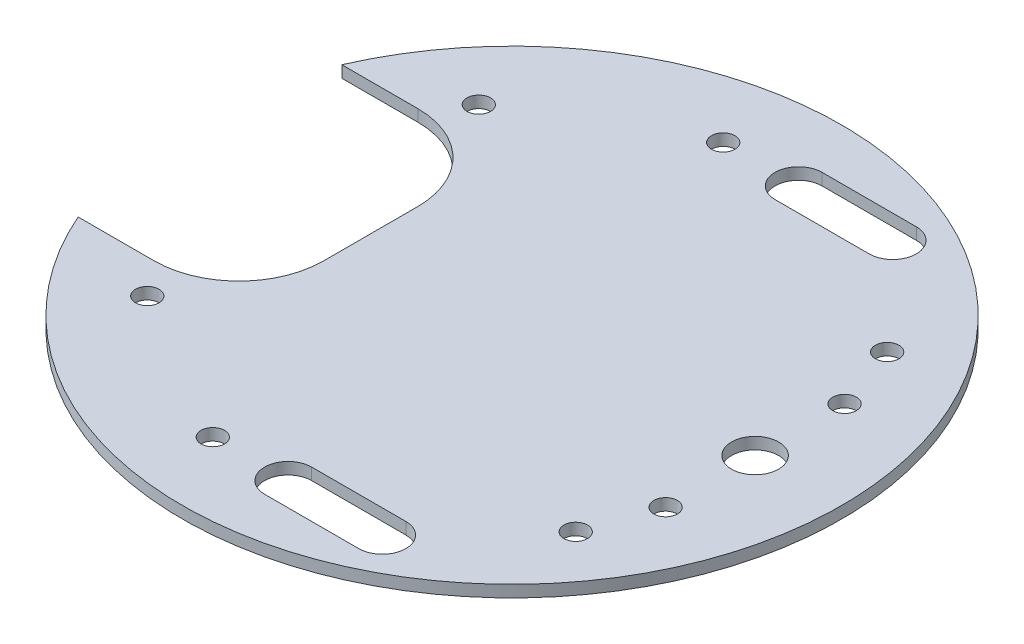
ISO-10303-21;
HEADER;
FILE_DESCRIPTION(('STEP AP214'),'2;1');
FILE_NAME('part.step','',(''),(''),'','','');
FILE_SCHEMA(('AUTOMOTIVE_DESIGN { 1 0 10303 214 1 1 1 1 }'));
ENDSEC;
DATA;
#1=APPLICATION_CONTEXT('core data for automotive mechanical design processes');
#2=APPLICATION_PROTOCOL_DEFINITION('international standard','automotive_design',2000,#1);
#3=PRODUCT_CONTEXT('',#1,'mechanical');
#4=PRODUCT('Part','Part','',(#3));
#5=PRODUCT_RELATED_PRODUCT_CATEGORY('part','',(#4));
#6=PRODUCT_DEFINITION_FORMATION('','',#4);
#7=PRODUCT_DEFINITION_CONTEXT('part definition',#1,'design');
#8=PRODUCT_DEFINITION('design','',#6,#7);
#9=PRODUCT_DEFINITION_SHAPE('','',#8);
#10=(LENGTH_UNIT() NAMED_UNIT(*) SI_UNIT(.MILLI.,.METRE.));
#11=(NAMED_UNIT(*) PLANE_ANGLE_UNIT() SI_UNIT($,.RADIAN.));
#12=(NAMED_UNIT(*) SI_UNIT($,.STERADIAN.) SOLID_ANGLE_UNIT());
#13=UNCERTAINTY_MEASURE_WITH_UNIT(LENGTH_MEASURE(1.E-05),#10,'distance_accuracy_value','');
#14=(GEOMETRIC_REPRESENTATION_CONTEXT(3) GLOBAL_UNCERTAINTY_ASSIGNED_CONTEXT((#13)) GLOBAL_UNIT_ASSIGNED_CONTEXT((#10,
#11,#12)) REPRESENTATION_CONTEXT('',''));
#15=CARTESIAN_POINT('',(0.,0.,0.));
#16=DIRECTION('',(0.,0.,1.));
#17=DIRECTION('',(1.,0.,0.));
#18=AXIS2_PLACEMENT_3D('',#15,#16,#17);
#19=CARTESIAN_POINT('',(0.,3.175,0.));
#20=DIRECTION('',(0.,-1.,0.));
#21=DIRECTION('',(0.,0.,-1.));
#22=AXIS2_PLACEMENT_3D('',#19,#20,#21);
#23=CYLINDRICAL_SURFACE('',#22,88.9);
#24=CARTESIAN_POINT('',(0.,3.175,0.));
#25=DIRECTION('',(0.,1.,0.));
#26=DIRECTION('',(0.,0.,1.));
#27=AXIS2_PLACEMENT_3D('',#24,#25,#26);
#28=CIRCLE('',#27,88.9);
#29=CARTESIAN_POINT('',(-81.4781958563148,3.175,35.56));
#30=VERTEX_POINT('',#29);
#31=CARTESIAN_POINT('',(-81.4781958563148,3.175,-35.56));
#32=VERTEX_POINT('',#31);
#33=EDGE_CURVE('E270',#30,#32,#28,.T.);
#34=ORIENTED_EDGE('',*,*,#33,.F.);
#35=DIRECTION('',(0.,-1.,0.));
#36=VECTOR('',#35,1.);
#37=CARTESIAN_POINT('',(-81.4781958563148,3.175,35.56));
#38=LINE('',#37,#36);
#39=CARTESIAN_POINT('',(-81.4781958563148,0.,35.56));
#40=VERTEX_POINT('',#39);
#41=EDGE_CURVE('E266',#30,#40,#38,.T.);
#42=ORIENTED_EDGE('',*,*,#41,.T.);
#43=CARTESIAN_POINT('',(0.,0.,0.));
#44=DIRECTION('',(0.,1.,0.));
#45=DIRECTION('',(0.,0.,1.));
#46=AXIS2_PLACEMENT_3D('',#43,#44,#45);
#47=CIRCLE('',#46,88.9);
#48=CARTESIAN_POINT('',(-81.4781958563148,0.,-35.56));
#49=VERTEX_POINT('',#48);
#50=EDGE_CURVE('E269',#40,#49,#47,.T.);
#51=ORIENTED_EDGE('',*,*,#50,.T.);
#52=DIRECTION('',(0.,-1.,0.));
#53=VECTOR('',#52,1.);
#54=CARTESIAN_POINT('',(-81.4781958563148,3.175,-35.56));
#55=LINE('',#54,#53);
#56=EDGE_CURVE('E261',#49,#32,#55,.F.);
#57=ORIENTED_EDGE('',*,*,#56,.T.);
#58=EDGE_LOOP('',(#34,#42,#51,#57));
#59=FACE_BOUND('',#58,.T.);
#60=ADVANCED_FACE('F33',(#59),#23,.T.);
#61=CARTESIAN_POINT('',(0.,3.175,0.));
#62=DIRECTION('',(0.,1.,0.));
#63=DIRECTION('',(0.,0.,1.));
#64=AXIS2_PLACEMENT_3D('',#61,#62,#63);
#65=PLANE('',#64);
#66=CARTESIAN_POINT('',(59.175,3.175,42.));
#67=DIRECTION('',(0.,-1.,0.));
#68=DIRECTION('',(0.,0.,-1.));
#69=AXIS2_PLACEMENT_3D('',#66,#67,#68);
#70=CIRCLE('',#69,3.175);
#71=CARTESIAN_POINT('',(59.175,3.175,38.825));
#72=VERTEX_POINT('',#71);
#73=EDGE_CURVE('E299',#72,#72,#70,.T.);
#74=ORIENTED_EDGE('',*,*,#73,.T.);
#75=EDGE_LOOP('',(#74));
#76=FACE_BOUND('',#75,.T.);
#77=CARTESIAN_POINT('',(59.175,3.175,-42.));
#78=DIRECTION('',(0.,1.,0.));
#79=DIRECTION('',(0.,0.,1.));
#80=AXIS2_PLACEMENT_3D('',#77,#78,#79);
#81=CIRCLE('',#80,3.175);
#82=CARTESIAN_POINT('',(59.175,3.175,-38.825));
#83=VERTEX_POINT('',#82);
#84=EDGE_CURVE('E162',#83,#83,#81,.T.);
#85=ORIENTED_EDGE('',*,*,#84,.F.);
#86=EDGE_LOOP('',(#85));
#87=FACE_BOUND('',#86,.T.);
#88=DIRECTION('',(1.,0.,0.));
#89=VECTOR('',#88,1.);
#90=CARTESIAN_POINT('',(0.,3.175,-62.4827214621127));
#91=LINE('',#90,#89);
#92=CARTESIAN_POINT('',(8.44233372588642,3.175,-62.4827214621127));
#93=VERTEX_POINT('',#92);
#94=CARTESIAN_POINT('',(33.8423337258864,3.175,-62.4827214621127));
#95=VERTEX_POINT('',#94);
#96=EDGE_CURVE('E50',#93,#95,#91,.T.);
#97=ORIENTED_EDGE('',*,*,#96,.F.);
#98=CARTESIAN_POINT('',(8.44233372588642,3.175,-68.8327214621127));
#99=DIRECTION('',(0.,1.,0.));
#100=DIRECTION('',(0.,0.,1.));
#101=AXIS2_PLACEMENT_3D('',#98,#99,#100);
#102=CIRCLE('',#101,6.34999999999999);
#103=CARTESIAN_POINT('',(8.44233372588642,3.175,-75.1827214621127));
#104=VERTEX_POINT('',#103);
#105=EDGE_CURVE('E156',#104,#93,#102,.T.);
#106=ORIENTED_EDGE('',*,*,#105,.F.);
#107=DIRECTION('',(1.,0.,0.));
#108=VECTOR('',#107,1.);
#109=CARTESIAN_POINT('',(0.,3.175,-75.1827214621127));
#110=LINE('',#109,#108);
#111=CARTESIAN_POINT('',(33.8423337258864,3.175,-75.1827214621127));
#112=VERTEX_POINT('',#111);
#113=EDGE_CURVE('E159',#104,#112,#110,.T.);
#114=ORIENTED_EDGE('',*,*,#113,.T.);
#115=CARTESIAN_POINT('',(33.8423337258864,3.175,-68.8327214621127));
#116=DIRECTION('',(0.,1.,0.));
#117=DIRECTION('',(0.,0.,1.));
#118=AXIS2_PLACEMENT_3D('',#115,#116,#117);
#119=CIRCLE('',#118,6.34999999999999);
#120=EDGE_CURVE('E168',#95,#112,#119,.T.);
#121=ORIENTED_EDGE('',*,*,#120,.F.);
#122=EDGE_LOOP('',(#97,#106,#114,#121));
#123=FACE_BOUND('',#122,.T.);
#124=CARTESIAN_POINT('',(65.5497185348647,3.175,0.));
#125=DIRECTION('',(0.,1.,0.));
#126=DIRECTION('',(0.,0.,1.));
#127=AXIS2_PLACEMENT_3D('',#124,#125,#126);
#128=CIRCLE('',#127,6.35);
#129=CARTESIAN_POINT('',(65.5497185348647,3.175,6.35));
#130=VERTEX_POINT('',#129);
#131=EDGE_CURVE('E181',#130,#130,#128,.T.);
#132=ORIENTED_EDGE('',*,*,#131,.F.);
#133=EDGE_LOOP('',(#132));
#134=FACE_BOUND('',#133,.T.);
#135=DIRECTION('',(1.,0.,0.));
#136=VECTOR('',#135,1.);
#137=CARTESIAN_POINT('',(0.,3.175,75.1827214621126));
#138=LINE('',#137,#136);
#139=CARTESIAN_POINT('',(8.44233372588644,3.175,75.1827214621126));
#140=VERTEX_POINT('',#139);
#141=CARTESIAN_POINT('',(33.8423337258864,3.175,75.1827214621126));
#142=VERTEX_POINT('',#141);
#143=EDGE_CURVE('E58',#140,#142,#138,.T.);
#144=ORIENTED_EDGE('',*,*,#143,.F.);
#145=CARTESIAN_POINT('',(8.44233372588644,3.175,68.8327214621126));
#146=DIRECTION('',(0.,1.,0.));
#147=DIRECTION('',(0.,0.,1.));
#148=AXIS2_PLACEMENT_3D('',#145,#146,#147);
#149=CIRCLE('',#148,6.34999999999999);
#150=CARTESIAN_POINT('',(8.44233372588644,3.175,62.4827214621126));
#151=VERTEX_POINT('',#150);
#152=EDGE_CURVE('E189',#151,#140,#149,.T.);
#153=ORIENTED_EDGE('',*,*,#152,.F.);
#154=DIRECTION('',(1.,0.,0.));
#155=VECTOR('',#154,1.);
#156=CARTESIAN_POINT('',(0.,3.175,62.4827214621126));
#157=LINE('',#156,#155);
#158=CARTESIAN_POINT('',(33.8423337258864,3.175,62.4827214621126));
#159=VERTEX_POINT('',#158);
#160=EDGE_CURVE('E204',#151,#159,#157,.T.);
#161=ORIENTED_EDGE('',*,*,#160,.T.);
#162=CARTESIAN_POINT('',(33.8423337258864,3.175,68.8327214621126));
#163=DIRECTION('',(0.,1.,0.));
#164=DIRECTION('',(0.,0.,1.));
#165=AXIS2_PLACEMENT_3D('',#162,#163,#164);
#166=CIRCLE('',#165,6.34999999999999);
#167=EDGE_CURVE('E200',#142,#159,#166,.T.);
#168=ORIENTED_EDGE('',*,*,#167,.F.);
#169=EDGE_LOOP('',(#144,#153,#161,#168));
#170=FACE_BOUND('',#169,.T.);
#171=DIRECTION('',(1.,0.,0.));
#172=VECTOR('',#171,1.);
#173=CARTESIAN_POINT('',(-88.9,3.175,35.56));
#174=LINE('',#173,#172);
#175=CARTESIAN_POINT('',(-60.96,3.175,35.56));
#176=VERTEX_POINT('',#175);
#177=EDGE_CURVE('E247',#30,#176,#174,.T.);
#178=ORIENTED_EDGE('',*,*,#177,.F.);
#179=ORIENTED_EDGE('',*,*,#33,.T.);
#180=DIRECTION('',(-1.,0.,0.));
#181=VECTOR('',#180,1.);
#182=CARTESIAN_POINT('',(-38.1,3.175,-35.56));
#183=LINE('',#182,#181);
#184=CARTESIAN_POINT('',(-60.96,3.175,-35.56));
#185=VERTEX_POINT('',#184);
#186=EDGE_CURVE('E250',#185,#32,#183,.T.);
#187=ORIENTED_EDGE('',*,*,#186,.F.);
#188=CARTESIAN_POINT('',(-60.96,3.175,-12.7));
#189=DIRECTION('',(0.,1.,0.));
#190=DIRECTION('',(0.,0.,1.));
#191=AXIS2_PLACEMENT_3D('',#188,#189,#190);
#192=CIRCLE('',#191,22.86);
#193=CARTESIAN_POINT('',(-38.1,3.175,-12.7));
#194=VERTEX_POINT('',#193);
#195=EDGE_CURVE('E42',#185,#194,#192,.F.);
#196=ORIENTED_EDGE('',*,*,#195,.T.);
#197=DIRECTION('',(0.,0.,-1.));
#198=VECTOR('',#197,1.);
#199=CARTESIAN_POINT('',(-38.1,3.175,35.56));
#200=LINE('',#199,#198);
#201=CARTESIAN_POINT('',(-38.1,3.175,12.7));
#202=VERTEX_POINT('',#201);
#203=EDGE_CURVE('E246',#202,#194,#200,.T.);
#204=ORIENTED_EDGE('',*,*,#203,.F.);
#205=CARTESIAN_POINT('',(-60.96,3.175,12.7));
#206=DIRECTION('',(0.,1.,0.));
#207=DIRECTION('',(0.,0.,1.));
#208=AXIS2_PLACEMENT_3D('',#205,#206,#207);
#209=CIRCLE('',#208,22.86);
#210=EDGE_CURVE('E288',#202,#176,#209,.F.);
#211=ORIENTED_EDGE('',*,*,#210,.T.);
#212=EDGE_LOOP('',(#178,#179,#187,#196,#204,#211));
#213=FACE_BOUND('',#212,.T.);
#214=CARTESIAN_POINT('',(-53.672052260751,3.175,44.7027214621126));
#215=DIRECTION('',(0.,1.,0.));
#216=DIRECTION('',(0.,0.,1.));
#217=AXIS2_PLACEMENT_3D('',#214,#215,#216);
#218=CIRCLE('',#217,3.175);
#219=CARTESIAN_POINT('',(-53.672052260751,3.175,47.8777214621126));
#220=VERTEX_POINT('',#219);
#221=EDGE_CURVE('E240',#220,#220,#218,.T.);
#222=ORIENTED_EDGE('',*,*,#221,.F.);
#223=EDGE_LOOP('',(#222));
#224=FACE_BOUND('',#223,.T.);
#225=CARTESIAN_POINT('',(-11.8776662741139,3.175,68.8327214621126));
#226=DIRECTION('',(0.,1.,0.));
#227=DIRECTION('',(0.,0.,1.));
#228=AXIS2_PLACEMENT_3D('',#225,#226,#227);
#229=CIRCLE('',#228,3.17499999999999);
#230=CARTESIAN_POINT('',(-11.8776662741139,3.175,72.0077214621126));
#231=VERTEX_POINT('',#230);
#232=EDGE_CURVE('E234',#231,#231,#229,.T.);
#233=ORIENTED_EDGE('',*,*,#232,.F.);
#234=EDGE_LOOP('',(#233));
#235=FACE_BOUND('',#234,.T.);
#236=CARTESIAN_POINT('',(65.5497185348648,3.175,24.13));
#237=DIRECTION('',(0.,1.,0.));
#238=DIRECTION('',(0.,0.,1.));
#239=AXIS2_PLACEMENT_3D('',#236,#237,#238);
#240=CIRCLE('',#239,3.175);
#241=CARTESIAN_POINT('',(65.5497185348648,3.175,27.305));
#242=VERTEX_POINT('',#241);
#243=EDGE_CURVE('E228',#242,#242,#240,.T.);
#244=ORIENTED_EDGE('',*,*,#243,.F.);
#245=EDGE_LOOP('',(#244));
#246=FACE_BOUND('',#245,.T.);
#247=CARTESIAN_POINT('',(65.5497185348648,3.175,-24.13));
#248=DIRECTION('',(0.,1.,0.));
#249=DIRECTION('',(0.,0.,1.));
#250=AXIS2_PLACEMENT_3D('',#247,#248,#249);
#251=CIRCLE('',#250,3.175);
#252=CARTESIAN_POINT('',(65.5497185348648,3.175,-20.955));
#253=VERTEX_POINT('',#252);
#254=EDGE_CURVE('E222',#253,#253,#251,.T.);
#255=ORIENTED_EDGE('',*,*,#254,.F.);
#256=EDGE_LOOP('',(#255));
#257=FACE_BOUND('',#256,.T.);
#258=CARTESIAN_POINT('',(-11.877666274114,3.175,-68.8327214621127));
#259=DIRECTION('',(0.,1.,0.));
#260=DIRECTION('',(0.,0.,1.));
#261=AXIS2_PLACEMENT_3D('',#258,#259,#260);
#262=CIRCLE('',#261,3.175);
#263=CARTESIAN_POINT('',(-11.877666274114,3.175,-65.6577214621127));
#264=VERTEX_POINT('',#263);
#265=EDGE_CURVE('E215',#264,#264,#262,.T.);
#266=ORIENTED_EDGE('',*,*,#265,.F.);
#267=EDGE_LOOP('',(#266));
#268=FACE_BOUND('',#267,.T.);
#269=CARTESIAN_POINT('',(-53.672052260751,3.175,-44.7027214621127));
#270=DIRECTION('',(0.,1.,0.));
#271=DIRECTION('',(0.,0.,1.));
#272=AXIS2_PLACEMENT_3D('',#269,#270,#271);
#273=CIRCLE('',#272,3.17499999999999);
#274=CARTESIAN_POINT('',(-53.672052260751,3.175,-41.5277214621127));
#275=VERTEX_POINT('',#274);
#276=EDGE_CURVE('E218',#275,#275,#273,.T.);
#277=ORIENTED_EDGE('',*,*,#276,.F.);
#278=EDGE_LOOP('',(#277));
#279=FACE_BOUND('',#278,.T.);
#280=ADVANCED_FACE('F305',(#76,#87,#123,#134,#170,#213,#224,#235,#246,#257,#268,#279),#65,.T.);
#281=CARTESIAN_POINT('',(0.,0.,0.));
#282=DIRECTION('',(0.,1.,0.));
#283=DIRECTION('',(0.,0.,1.));
#284=AXIS2_PLACEMENT_3D('',#281,#282,#283);
#285=PLANE('',#284);
#286=CARTESIAN_POINT('',(59.175,0.,42.));
#287=DIRECTION('',(0.,1.,0.));
#288=DIRECTION('',(0.,0.,1.));
#289=AXIS2_PLACEMENT_3D('',#286,#287,#288);
#290=CIRCLE('',#289,3.175);
#291=CARTESIAN_POINT('',(59.175,0.,45.175));
#292=VERTEX_POINT('',#291);
#293=EDGE_CURVE('E37',#292,#292,#290,.F.);
#294=ORIENTED_EDGE('',*,*,#293,.F.);
#295=EDGE_LOOP('',(#294));
#296=FACE_BOUND('',#295,.T.);
#297=CARTESIAN_POINT('',(59.175,0.,-42.));
#298=DIRECTION('',(0.,1.,0.));
#299=DIRECTION('',(0.,0.,1.));
#300=AXIS2_PLACEMENT_3D('',#297,#298,#299);
#301=CIRCLE('',#300,3.175);
#302=CARTESIAN_POINT('',(59.175,0.,-38.825));
#303=VERTEX_POINT('',#302);
#304=EDGE_CURVE('E201',#303,#303,#301,.T.);
#305=ORIENTED_EDGE('',*,*,#304,.T.);
#306=EDGE_LOOP('',(#305));
#307=FACE_BOUND('',#306,.T.);
#308=CARTESIAN_POINT('',(8.44233372588642,0.,-68.8327214621127));
#309=DIRECTION('',(0.,1.,0.));
#310=DIRECTION('',(0.,0.,1.));
#311=AXIS2_PLACEMENT_3D('',#308,#309,#310);
#312=CIRCLE('',#311,6.34999999999999);
#313=CARTESIAN_POINT('',(8.44233372588642,0.,-75.1827214621127));
#314=VERTEX_POINT('',#313);
#315=CARTESIAN_POINT('',(8.44233372588642,0.,-62.4827214621127));
#316=VERTEX_POINT('',#315);
#317=EDGE_CURVE('E143',#314,#316,#312,.T.);
#318=ORIENTED_EDGE('',*,*,#317,.T.);
#319=DIRECTION('',(1.,0.,0.));
#320=VECTOR('',#319,1.);
#321=CARTESIAN_POINT('',(0.,0.,-62.4827214621127));
#322=LINE('',#321,#320);
#323=CARTESIAN_POINT('',(33.8423337258864,0.,-62.4827214621127));
#324=VERTEX_POINT('',#323);
#325=EDGE_CURVE('E137',#316,#324,#322,.T.);
#326=ORIENTED_EDGE('',*,*,#325,.T.);
#327=CARTESIAN_POINT('',(33.8423337258864,0.,-68.8327214621127));
#328=DIRECTION('',(0.,1.,0.));
#329=DIRECTION('',(0.,0.,1.));
#330=AXIS2_PLACEMENT_3D('',#327,#328,#329);
#331=CIRCLE('',#330,6.34999999999999);
#332=CARTESIAN_POINT('',(33.8423337258864,0.,-75.1827214621127));
#333=VERTEX_POINT('',#332);
#334=EDGE_CURVE('E146',#324,#333,#331,.T.);
#335=ORIENTED_EDGE('',*,*,#334,.T.);
#336=DIRECTION('',(1.,0.,0.));
#337=VECTOR('',#336,1.);
#338=CARTESIAN_POINT('',(0.,0.,-75.1827214621127));
#339=LINE('',#338,#337);
#340=EDGE_CURVE('E151',#314,#333,#339,.T.);
#341=ORIENTED_EDGE('',*,*,#340,.F.);
#342=EDGE_LOOP('',(#318,#326,#335,#341));
#343=FACE_BOUND('',#342,.T.);
#344=CARTESIAN_POINT('',(65.5497185348647,0.,0.));
#345=DIRECTION('',(0.,1.,0.));
#346=DIRECTION('',(0.,0.,1.));
#347=AXIS2_PLACEMENT_3D('',#344,#345,#346);
#348=CIRCLE('',#347,6.35);
#349=CARTESIAN_POINT('',(65.5497185348647,0.,6.35));
#350=VERTEX_POINT('',#349);
#351=EDGE_CURVE('E169',#350,#350,#348,.T.);
#352=ORIENTED_EDGE('',*,*,#351,.T.);
#353=EDGE_LOOP('',(#352));
#354=FACE_BOUND('',#353,.T.);
#355=CARTESIAN_POINT('',(8.44233372588644,0.,68.8327214621126));
#356=DIRECTION('',(0.,1.,0.));
#357=DIRECTION('',(0.,0.,1.));
#358=AXIS2_PLACEMENT_3D('',#355,#356,#357);
#359=CIRCLE('',#358,6.34999999999999);
#360=CARTESIAN_POINT('',(8.44233372588644,0.,62.4827214621126));
#361=VERTEX_POINT('',#360);
#362=CARTESIAN_POINT('',(8.44233372588644,0.,75.1827214621126));
#363=VERTEX_POINT('',#362);
#364=EDGE_CURVE('E195',#361,#363,#359,.T.);
#365=ORIENTED_EDGE('',*,*,#364,.T.);
#366=DIRECTION('',(1.,0.,0.));
#367=VECTOR('',#366,1.);
#368=CARTESIAN_POINT('',(0.,0.,75.1827214621126));
#369=LINE('',#368,#367);
#370=CARTESIAN_POINT('',(33.8423337258864,0.,75.1827214621126));
#371=VERTEX_POINT('',#370);
#372=EDGE_CURVE('E185',#363,#371,#369,.T.);
#373=ORIENTED_EDGE('',*,*,#372,.T.);
#374=CARTESIAN_POINT('',(33.8423337258864,0.,68.8327214621126));
#375=DIRECTION('',(0.,1.,0.));
#376=DIRECTION('',(0.,0.,1.));
#377=AXIS2_PLACEMENT_3D('',#374,#375,#376);
#378=CIRCLE('',#377,6.34999999999999);
#379=CARTESIAN_POINT('',(33.8423337258864,0.,62.4827214621126));
#380=VERTEX_POINT('',#379);
#381=EDGE_CURVE('E188',#371,#380,#378,.T.);
#382=ORIENTED_EDGE('',*,*,#381,.T.);
#383=DIRECTION('',(1.,0.,0.));
#384=VECTOR('',#383,1.);
#385=CARTESIAN_POINT('',(0.,0.,62.4827214621126));
#386=LINE('',#385,#384);
#387=EDGE_CURVE('E192',#361,#380,#386,.T.);
#388=ORIENTED_EDGE('',*,*,#387,.F.);
#389=EDGE_LOOP('',(#365,#373,#382,#388));
#390=FACE_BOUND('',#389,.T.);
#391=CARTESIAN_POINT('',(-53.672052260751,0.,44.7027214621126));
#392=DIRECTION('',(0.,1.,0.));
#393=DIRECTION('',(0.,0.,1.));
#394=AXIS2_PLACEMENT_3D('',#391,#392,#393);
#395=CIRCLE('',#394,3.175);
#396=CARTESIAN_POINT('',(-53.672052260751,0.,47.8777214621126));
#397=VERTEX_POINT('',#396);
#398=EDGE_CURVE('E243',#397,#397,#395,.T.);
#399=ORIENTED_EDGE('',*,*,#398,.T.);
#400=EDGE_LOOP('',(#399));
#401=FACE_BOUND('',#400,.T.);
#402=CARTESIAN_POINT('',(-11.8776662741139,0.,68.8327214621126));
#403=DIRECTION('',(0.,1.,0.));
#404=DIRECTION('',(0.,0.,1.));
#405=AXIS2_PLACEMENT_3D('',#402,#403,#404);
#406=CIRCLE('',#405,3.17499999999999);
#407=CARTESIAN_POINT('',(-11.8776662741139,0.,72.0077214621126));
#408=VERTEX_POINT('',#407);
#409=EDGE_CURVE('E237',#408,#408,#406,.T.);
#410=ORIENTED_EDGE('',*,*,#409,.T.);
#411=EDGE_LOOP('',(#410));
#412=FACE_BOUND('',#411,.T.);
#413=CARTESIAN_POINT('',(65.5497185348648,0.,24.13));
#414=DIRECTION('',(0.,1.,0.));
#415=DIRECTION('',(0.,0.,1.));
#416=AXIS2_PLACEMENT_3D('',#413,#414,#415);
#417=CIRCLE('',#416,3.175);
#418=CARTESIAN_POINT('',(65.5497185348648,0.,27.305));
#419=VERTEX_POINT('',#418);
#420=EDGE_CURVE('E231',#419,#419,#417,.T.);
#421=ORIENTED_EDGE('',*,*,#420,.T.);
#422=EDGE_LOOP('',(#421));
#423=FACE_BOUND('',#422,.T.);
#424=CARTESIAN_POINT('',(65.5497185348648,0.,-24.13));
#425=DIRECTION('',(0.,1.,0.));
#426=DIRECTION('',(0.,0.,1.));
#427=AXIS2_PLACEMENT_3D('',#424,#425,#426);
#428=CIRCLE('',#427,3.175);
#429=CARTESIAN_POINT('',(65.5497185348648,0.,-20.955));
#430=VERTEX_POINT('',#429);
#431=EDGE_CURVE('E225',#430,#430,#428,.T.);
#432=ORIENTED_EDGE('',*,*,#431,.T.);
#433=EDGE_LOOP('',(#432));
#434=FACE_BOUND('',#433,.T.);
#435=CARTESIAN_POINT('',(-11.877666274114,0.,-68.8327214621127));
#436=DIRECTION('',(0.,1.,0.));
#437=DIRECTION('',(0.,0.,1.));
#438=AXIS2_PLACEMENT_3D('',#435,#436,#437);
#439=CIRCLE('',#438,3.175);
#440=CARTESIAN_POINT('',(-11.877666274114,0.,-65.6577214621127));
#441=VERTEX_POINT('',#440);
#442=EDGE_CURVE('E219',#441,#441,#439,.T.);
#443=ORIENTED_EDGE('',*,*,#442,.T.);
#444=EDGE_LOOP('',(#443));
#445=FACE_BOUND('',#444,.T.);
#446=CARTESIAN_POINT('',(-53.672052260751,0.,-44.7027214621127));
#447=DIRECTION('',(0.,1.,0.));
#448=DIRECTION('',(0.,0.,1.));
#449=AXIS2_PLACEMENT_3D('',#446,#447,#448);
#450=CIRCLE('',#449,3.17499999999999);
#451=CARTESIAN_POINT('',(-53.672052260751,0.,-41.5277214621127));
#452=VERTEX_POINT('',#451);
#453=EDGE_CURVE('E258',#452,#452,#450,.T.);
#454=ORIENTED_EDGE('',*,*,#453,.T.);
#455=EDGE_LOOP('',(#454));
#456=FACE_BOUND('',#455,.T.);
#457=ORIENTED_EDGE('',*,*,#50,.F.);
#458=DIRECTION('',(1.,0.,0.));
#459=VECTOR('',#458,1.);
#460=CARTESIAN_POINT('',(0.,0.,35.56));
#461=LINE('',#460,#459);
#462=CARTESIAN_POINT('',(-60.96,0.,35.56));
#463=VERTEX_POINT('',#462);
#464=EDGE_CURVE('E273',#40,#463,#461,.T.);
#465=ORIENTED_EDGE('',*,*,#464,.T.);
#466=CARTESIAN_POINT('',(-60.96,0.,12.7));
#467=DIRECTION('',(0.,1.,0.));
#468=DIRECTION('',(0.,0.,1.));
#469=AXIS2_PLACEMENT_3D('',#466,#467,#468);
#470=CIRCLE('',#469,22.86);
#471=CARTESIAN_POINT('',(-38.1,0.,12.7));
#472=VERTEX_POINT('',#471);
#473=EDGE_CURVE('E290',#463,#472,#470,.T.);
#474=ORIENTED_EDGE('',*,*,#473,.T.);
#475=DIRECTION('',(0.,0.,-1.));
#476=VECTOR('',#475,1.);
#477=CARTESIAN_POINT('',(-38.1,0.,35.56));
#478=LINE('',#477,#476);
#479=CARTESIAN_POINT('',(-38.1,0.,-12.7));
#480=VERTEX_POINT('',#479);
#481=EDGE_CURVE('E251',#472,#480,#478,.T.);
#482=ORIENTED_EDGE('',*,*,#481,.T.);
#483=CARTESIAN_POINT('',(-60.96,0.,-12.7));
#484=DIRECTION('',(0.,1.,0.));
#485=DIRECTION('',(0.,0.,1.));
#486=AXIS2_PLACEMENT_3D('',#483,#484,#485);
#487=CIRCLE('',#486,22.86);
#488=CARTESIAN_POINT('',(-60.96,0.,-35.56));
#489=VERTEX_POINT('',#488);
#490=EDGE_CURVE('E12',#480,#489,#487,.T.);
#491=ORIENTED_EDGE('',*,*,#490,.T.);
#492=DIRECTION('',(-1.,0.,0.));
#493=VECTOR('',#492,1.);
#494=CARTESIAN_POINT('',(-38.1,0.,-35.56));
#495=LINE('',#494,#493);
#496=EDGE_CURVE('E175',#489,#49,#495,.T.);
#497=ORIENTED_EDGE('',*,*,#496,.T.);
#498=EDGE_LOOP('',(#457,#465,#474,#482,#491,#497));
#499=FACE_BOUND('',#498,.T.);
#500=ADVANCED_FACE('F153',(#296,#307,#343,#354,#390,#401,#412,#423,#434,#445,#456,#499),#285,.F.);
#501=CARTESIAN_POINT('',(-53.672052260751,0.,-44.7027214621127));
#502=DIRECTION('',(0.,1.,0.));
#503=DIRECTION('',(0.,0.,1.));
#504=AXIS2_PLACEMENT_3D('',#501,#502,#503);
#505=CYLINDRICAL_SURFACE('',#504,3.17499999999999);
#506=ORIENTED_EDGE('',*,*,#453,.F.);
#507=EDGE_LOOP('',(#506));
#508=FACE_BOUND('',#507,.T.);
#509=ORIENTED_EDGE('',*,*,#276,.T.);
#510=EDGE_LOOP('',(#509));
#511=FACE_BOUND('',#510,.T.);
#512=ADVANCED_FACE('F369',(#508,#511),#505,.F.);
#513=CARTESIAN_POINT('',(-11.877666274114,0.,-68.8327214621127));
#514=DIRECTION('',(0.,1.,0.));
#515=DIRECTION('',(0.,0.,1.));
#516=AXIS2_PLACEMENT_3D('',#513,#514,#515);
#517=CYLINDRICAL_SURFACE('',#516,3.175);
#518=ORIENTED_EDGE('',*,*,#442,.F.);
#519=EDGE_LOOP('',(#518));
#520=FACE_BOUND('',#519,.T.);
#521=ORIENTED_EDGE('',*,*,#265,.T.);
#522=EDGE_LOOP('',(#521));
#523=FACE_BOUND('',#522,.T.);
#524=ADVANCED_FACE('F371',(#520,#523),#517,.F.);
#525=CARTESIAN_POINT('',(65.5497185348648,0.,-24.13));
#526=DIRECTION('',(0.,1.,0.));
#527=DIRECTION('',(0.,0.,1.));
#528=AXIS2_PLACEMENT_3D('',#525,#526,#527);
#529=CYLINDRICAL_SURFACE('',#528,3.175);
#530=ORIENTED_EDGE('',*,*,#431,.F.);
#531=EDGE_LOOP('',(#530));
#532=FACE_BOUND('',#531,.T.);
#533=ORIENTED_EDGE('',*,*,#254,.T.);
#534=EDGE_LOOP('',(#533));
#535=FACE_BOUND('',#534,.T.);
#536=ADVANCED_FACE('F378',(#532,#535),#529,.F.);
#537=CARTESIAN_POINT('',(65.5497185348648,0.,24.13));
#538=DIRECTION('',(0.,1.,0.));
#539=DIRECTION('',(0.,0.,1.));
#540=AXIS2_PLACEMENT_3D('',#537,#538,#539);
#541=CYLINDRICAL_SURFACE('',#540,3.175);
#542=ORIENTED_EDGE('',*,*,#420,.F.);
#543=EDGE_LOOP('',(#542));
#544=FACE_BOUND('',#543,.T.);
#545=ORIENTED_EDGE('',*,*,#243,.T.);
#546=EDGE_LOOP('',(#545));
#547=FACE_BOUND('',#546,.T.);
#548=ADVANCED_FACE('F395',(#544,#547),#541,.F.);
#549=CARTESIAN_POINT('',(-11.8776662741139,0.,68.8327214621126));
#550=DIRECTION('',(0.,1.,0.));
#551=DIRECTION('',(0.,0.,1.));
#552=AXIS2_PLACEMENT_3D('',#549,#550,#551);
#553=CYLINDRICAL_SURFACE('',#552,3.17499999999999);
#554=ORIENTED_EDGE('',*,*,#409,.F.);
#555=EDGE_LOOP('',(#554));
#556=FACE_BOUND('',#555,.T.);
#557=ORIENTED_EDGE('',*,*,#232,.T.);
#558=EDGE_LOOP('',(#557));
#559=FACE_BOUND('',#558,.T.);
#560=ADVANCED_FACE('F391',(#556,#559),#553,.F.);
#561=CARTESIAN_POINT('',(-53.672052260751,0.,44.7027214621126));
#562=DIRECTION('',(0.,1.,0.));
#563=DIRECTION('',(0.,0.,1.));
#564=AXIS2_PLACEMENT_3D('',#561,#562,#563);
#565=CYLINDRICAL_SURFACE('',#564,3.175);
#566=ORIENTED_EDGE('',*,*,#398,.F.);
#567=EDGE_LOOP('',(#566));
#568=FACE_BOUND('',#567,.T.);
#569=ORIENTED_EDGE('',*,*,#221,.T.);
#570=EDGE_LOOP('',(#569));
#571=FACE_BOUND('',#570,.T.);
#572=ADVANCED_FACE('F386',(#568,#571),#565,.F.);
#573=CARTESIAN_POINT('',(-88.9,0.,35.56));
#574=DIRECTION('',(0.,0.,1.));
#575=DIRECTION('',(1.,0.,0.));
#576=AXIS2_PLACEMENT_3D('',#573,#574,#575);
#577=PLANE('',#576);
#578=ORIENTED_EDGE('',*,*,#177,.T.);
#579=DIRECTION('',(0.,1.,0.));
#580=VECTOR('',#579,1.);
#581=CARTESIAN_POINT('',(-60.96,0.,35.56));
#582=LINE('',#581,#580);
#583=EDGE_CURVE('E283',#176,#463,#582,.F.);
#584=ORIENTED_EDGE('',*,*,#583,.T.);
#585=ORIENTED_EDGE('',*,*,#464,.F.);
#586=ORIENTED_EDGE('',*,*,#41,.F.);
#587=EDGE_LOOP('',(#578,#584,#585,#586));
#588=FACE_BOUND('',#587,.T.);
#589=ADVANCED_FACE('F354',(#588),#577,.F.);
#590=CARTESIAN_POINT('',(-38.1,0.,-35.56));
#591=DIRECTION('',(0.,0.,-1.));
#592=DIRECTION('',(-1.,0.,0.));
#593=AXIS2_PLACEMENT_3D('',#590,#591,#592);
#594=PLANE('',#593);
#595=ORIENTED_EDGE('',*,*,#496,.F.);
#596=DIRECTION('',(0.,1.,0.));
#597=VECTOR('',#596,1.);
#598=CARTESIAN_POINT('',(-60.96,3.175,-35.56));
#599=LINE('',#598,#597);
#600=EDGE_CURVE('E285',#489,#185,#599,.T.);
#601=ORIENTED_EDGE('',*,*,#600,.T.);
#602=ORIENTED_EDGE('',*,*,#186,.T.);
#603=ORIENTED_EDGE('',*,*,#56,.F.);
#604=EDGE_LOOP('',(#595,#601,#602,#603));
#605=FACE_BOUND('',#604,.T.);
#606=ADVANCED_FACE('F335',(#605),#594,.F.);
#607=CARTESIAN_POINT('',(-38.1,0.,35.56));
#608=DIRECTION('',(1.,0.,0.));
#609=DIRECTION('',(0.,0.,-1.));
#610=AXIS2_PLACEMENT_3D('',#607,#608,#609);
#611=PLANE('',#610);
#612=ORIENTED_EDGE('',*,*,#481,.F.);
#613=DIRECTION('',(0.,1.,0.));
#614=VECTOR('',#613,1.);
#615=CARTESIAN_POINT('',(-38.1,3.175,12.7));
#616=LINE('',#615,#614);
#617=EDGE_CURVE('E280',#472,#202,#616,.T.);
#618=ORIENTED_EDGE('',*,*,#617,.T.);
#619=ORIENTED_EDGE('',*,*,#203,.T.);
#620=DIRECTION('',(0.,1.,0.));
#621=VECTOR('',#620,1.);
#622=CARTESIAN_POINT('',(-38.1,0.,-12.7));
#623=LINE('',#622,#621);
#624=EDGE_CURVE('E278',#194,#480,#623,.F.);
#625=ORIENTED_EDGE('',*,*,#624,.T.);
#626=EDGE_LOOP('',(#612,#618,#619,#625));
#627=FACE_BOUND('',#626,.T.);
#628=ADVANCED_FACE('F327',(#627),#611,.F.);
#629=CARTESIAN_POINT('',(-60.96,0.,12.7));
#630=DIRECTION('',(0.,-1.,0.));
#631=DIRECTION('',(0.,0.,-1.));
#632=AXIS2_PLACEMENT_3D('',#629,#630,#631);
#633=CYLINDRICAL_SURFACE('',#632,22.86);
#634=ORIENTED_EDGE('',*,*,#473,.F.);
#635=ORIENTED_EDGE('',*,*,#583,.F.);
#636=ORIENTED_EDGE('',*,*,#210,.F.);
#637=ORIENTED_EDGE('',*,*,#617,.F.);
#638=EDGE_LOOP('',(#634,#635,#636,#637));
#639=FACE_BOUND('',#638,.T.);
#640=ADVANCED_FACE('F325',(#639),#633,.F.);
#641=CARTESIAN_POINT('',(-60.96,0.,-12.7));
#642=DIRECTION('',(0.,-1.,0.));
#643=DIRECTION('',(0.,0.,-1.));
#644=AXIS2_PLACEMENT_3D('',#641,#642,#643);
#645=CYLINDRICAL_SURFACE('',#644,22.86);
#646=ORIENTED_EDGE('',*,*,#490,.F.);
#647=ORIENTED_EDGE('',*,*,#624,.F.);
#648=ORIENTED_EDGE('',*,*,#195,.F.);
#649=ORIENTED_EDGE('',*,*,#600,.F.);
#650=EDGE_LOOP('',(#646,#647,#648,#649));
#651=FACE_BOUND('',#650,.T.);
#652=ADVANCED_FACE('F35',(#651),#645,.F.);
#653=CARTESIAN_POINT('',(0.,0.,75.1827214621126));
#654=DIRECTION('',(0.,0.,1.));
#655=DIRECTION('',(1.,0.,0.));
#656=AXIS2_PLACEMENT_3D('',#653,#654,#655);
#657=PLANE('',#656);
#658=ORIENTED_EDGE('',*,*,#143,.T.);
#659=DIRECTION('',(0.,1.,0.));
#660=VECTOR('',#659,1.);
#661=CARTESIAN_POINT('',(33.8423337258864,0.,75.1827214621126));
#662=LINE('',#661,#660);
#663=EDGE_CURVE('E198',#371,#142,#662,.T.);
#664=ORIENTED_EDGE('',*,*,#663,.F.);
#665=ORIENTED_EDGE('',*,*,#372,.F.);
#666=DIRECTION('',(0.,1.,0.));
#667=VECTOR('',#666,1.);
#668=CARTESIAN_POINT('',(8.44233372588644,0.,75.1827214621126));
#669=LINE('',#668,#667);
#670=EDGE_CURVE('E184',#363,#140,#669,.T.);
#671=ORIENTED_EDGE('',*,*,#670,.T.);
#672=EDGE_LOOP('',(#658,#664,#665,#671));
#673=FACE_BOUND('',#672,.T.);
#674=ADVANCED_FACE('F333',(#673),#657,.F.);
#675=CARTESIAN_POINT('',(8.44233372588644,0.,68.8327214621126));
#676=DIRECTION('',(0.,1.,0.));
#677=DIRECTION('',(0.,0.,1.));
#678=AXIS2_PLACEMENT_3D('',#675,#676,#677);
#679=CYLINDRICAL_SURFACE('',#678,6.34999999999999);
#680=ORIENTED_EDGE('',*,*,#152,.T.);
#681=ORIENTED_EDGE('',*,*,#670,.F.);
#682=ORIENTED_EDGE('',*,*,#364,.F.);
#683=DIRECTION('',(0.,1.,0.));
#684=VECTOR('',#683,1.);
#685=CARTESIAN_POINT('',(8.44233372588644,0.,62.4827214621126));
#686=LINE('',#685,#684);
#687=EDGE_CURVE('E210',#361,#151,#686,.T.);
#688=ORIENTED_EDGE('',*,*,#687,.T.);
#689=EDGE_LOOP('',(#680,#681,#682,#688));
#690=FACE_BOUND('',#689,.T.);
#691=ADVANCED_FACE('F405',(#690),#679,.F.);
#692=CARTESIAN_POINT('',(0.,0.,62.4827214621126));
#693=DIRECTION('',(0.,0.,1.));
#694=DIRECTION('',(1.,0.,0.));
#695=AXIS2_PLACEMENT_3D('',#692,#693,#694);
#696=PLANE('',#695);
#697=ORIENTED_EDGE('',*,*,#160,.F.);
#698=ORIENTED_EDGE('',*,*,#687,.F.);
#699=ORIENTED_EDGE('',*,*,#387,.T.);
#700=DIRECTION('',(0.,1.,0.));
#701=VECTOR('',#700,1.);
#702=CARTESIAN_POINT('',(33.8423337258864,0.,62.4827214621126));
#703=LINE('',#702,#701);
#704=EDGE_CURVE('E212',#380,#159,#703,.T.);
#705=ORIENTED_EDGE('',*,*,#704,.T.);
#706=EDGE_LOOP('',(#697,#698,#699,#705));
#707=FACE_BOUND('',#706,.T.);
#708=ADVANCED_FACE('F410',(#707),#696,.T.);
#709=CARTESIAN_POINT('',(33.8423337258864,0.,68.8327214621126));
#710=DIRECTION('',(0.,1.,0.));
#711=DIRECTION('',(0.,0.,1.));
#712=AXIS2_PLACEMENT_3D('',#709,#710,#711);
#713=CYLINDRICAL_SURFACE('',#712,6.34999999999999);
#714=ORIENTED_EDGE('',*,*,#167,.T.);
#715=ORIENTED_EDGE('',*,*,#704,.F.);
#716=ORIENTED_EDGE('',*,*,#381,.F.);
#717=ORIENTED_EDGE('',*,*,#663,.T.);
#718=EDGE_LOOP('',(#714,#715,#716,#717));
#719=FACE_BOUND('',#718,.T.);
#720=ADVANCED_FACE('F406',(#719),#713,.F.);
#721=CARTESIAN_POINT('',(65.5497185348647,0.,0.));
#722=DIRECTION('',(0.,1.,0.));
#723=DIRECTION('',(0.,0.,1.));
#724=AXIS2_PLACEMENT_3D('',#721,#722,#723);
#725=CYLINDRICAL_SURFACE('',#724,6.35);
#726=ORIENTED_EDGE('',*,*,#351,.F.);
#727=EDGE_LOOP('',(#726));
#728=FACE_BOUND('',#727,.T.);
#729=ORIENTED_EDGE('',*,*,#131,.T.);
#730=EDGE_LOOP('',(#729));
#731=FACE_BOUND('',#730,.T.);
#732=ADVANCED_FACE('F409',(#728,#731),#725,.F.);
#733=CARTESIAN_POINT('',(0.,0.,-62.4827214621127));
#734=DIRECTION('',(0.,0.,1.));
#735=DIRECTION('',(1.,0.,0.));
#736=AXIS2_PLACEMENT_3D('',#733,#734,#735);
#737=PLANE('',#736);
#738=ORIENTED_EDGE('',*,*,#96,.T.);
#739=DIRECTION('',(0.,1.,0.));
#740=VECTOR('',#739,1.);
#741=CARTESIAN_POINT('',(33.8423337258864,0.,-62.4827214621127));
#742=LINE('',#741,#740);
#743=EDGE_CURVE('E133',#324,#95,#742,.T.);
#744=ORIENTED_EDGE('',*,*,#743,.F.);
#745=ORIENTED_EDGE('',*,*,#325,.F.);
#746=DIRECTION('',(0.,1.,0.));
#747=VECTOR('',#746,1.);
#748=CARTESIAN_POINT('',(8.44233372588642,0.,-62.4827214621127));
#749=LINE('',#748,#747);
#750=EDGE_CURVE('E173',#316,#93,#749,.T.);
#751=ORIENTED_EDGE('',*,*,#750,.T.);
#752=EDGE_LOOP('',(#738,#744,#745,#751));
#753=FACE_BOUND('',#752,.T.);
#754=ADVANCED_FACE('F135',(#753),#737,.F.);
#755=CARTESIAN_POINT('',(8.44233372588642,0.,-68.8327214621127));
#756=DIRECTION('',(0.,1.,0.));
#757=DIRECTION('',(0.,0.,1.));
#758=AXIS2_PLACEMENT_3D('',#755,#756,#757);
#759=CYLINDRICAL_SURFACE('',#758,6.34999999999999);
#760=ORIENTED_EDGE('',*,*,#105,.T.);
#761=ORIENTED_EDGE('',*,*,#750,.F.);
#762=ORIENTED_EDGE('',*,*,#317,.F.);
#763=DIRECTION('',(0.,1.,0.));
#764=VECTOR('',#763,1.);
#765=CARTESIAN_POINT('',(8.44233372588642,0.,-75.1827214621127));
#766=LINE('',#765,#764);
#767=EDGE_CURVE('E176',#314,#104,#766,.T.);
#768=ORIENTED_EDGE('',*,*,#767,.T.);
#769=EDGE_LOOP('',(#760,#761,#762,#768));
#770=FACE_BOUND('',#769,.T.);
#771=ADVANCED_FACE('F423',(#770),#759,.F.);
#772=CARTESIAN_POINT('',(0.,0.,-75.1827214621127));
#773=DIRECTION('',(0.,0.,1.));
#774=DIRECTION('',(1.,0.,0.));
#775=AXIS2_PLACEMENT_3D('',#772,#773,#774);
#776=PLANE('',#775);
#777=ORIENTED_EDGE('',*,*,#113,.F.);
#778=ORIENTED_EDGE('',*,*,#767,.F.);
#779=ORIENTED_EDGE('',*,*,#340,.T.);
#780=DIRECTION('',(0.,1.,0.));
#781=VECTOR('',#780,1.);
#782=CARTESIAN_POINT('',(33.8423337258864,0.,-75.1827214621127));
#783=LINE('',#782,#781);
#784=EDGE_CURVE('E142',#333,#112,#783,.T.);
#785=ORIENTED_EDGE('',*,*,#784,.T.);
#786=EDGE_LOOP('',(#777,#778,#779,#785));
#787=FACE_BOUND('',#786,.T.);
#788=ADVANCED_FACE('F426',(#787),#776,.T.);
#789=CARTESIAN_POINT('',(33.8423337258864,0.,-68.8327214621127));
#790=DIRECTION('',(0.,1.,0.));
#791=DIRECTION('',(0.,0.,1.));
#792=AXIS2_PLACEMENT_3D('',#789,#790,#791);
#793=CYLINDRICAL_SURFACE('',#792,6.34999999999999);
#794=ORIENTED_EDGE('',*,*,#120,.T.);
#795=ORIENTED_EDGE('',*,*,#784,.F.);
#796=ORIENTED_EDGE('',*,*,#334,.F.);
#797=ORIENTED_EDGE('',*,*,#743,.T.);
#798=EDGE_LOOP('',(#794,#795,#796,#797));
#799=FACE_BOUND('',#798,.T.);
#800=ADVANCED_FACE('F147',(#799),#793,.F.);
#801=CARTESIAN_POINT('',(59.175,-6.825,-42.));
#802=DIRECTION('',(0.,1.,0.));
#803=DIRECTION('',(0.,0.,1.));
#804=AXIS2_PLACEMENT_3D('',#801,#802,#803);
#805=CYLINDRICAL_SURFACE('',#804,3.175);
#806=ORIENTED_EDGE('',*,*,#84,.T.);
#807=EDGE_LOOP('',(#806));
#808=FACE_BOUND('',#807,.T.);
#809=ORIENTED_EDGE('',*,*,#304,.F.);
#810=EDGE_LOOP('',(#809));
#811=FACE_BOUND('',#810,.T.);
#812=ADVANCED_FACE('F310',(#808,#811),#805,.F.);
#813=CARTESIAN_POINT('',(59.175,-6.825,42.));
#814=DIRECTION('',(0.,1.,0.));
#815=DIRECTION('',(0.,0.,1.));
#816=AXIS2_PLACEMENT_3D('',#813,#814,#815);
#817=CYLINDRICAL_SURFACE('',#816,3.175);
#818=ORIENTED_EDGE('',*,*,#73,.F.);
#819=EDGE_LOOP('',(#818));
#820=FACE_BOUND('',#819,.T.);
#821=ORIENTED_EDGE('',*,*,#293,.T.);
#822=EDGE_LOOP('',(#821));
#823=FACE_BOUND('',#822,.T.);
#824=ADVANCED_FACE('F308',(#820,#823),#817,.F.);
#825=CLOSED_SHELL('',(#60,#280,#500,#512,#524,#536,#548,#560,#572,#589,#606,#628,#640,#652,#674,
#691,#708,#720,#732,#754,#771,#788,#800,#812,#824));
#826=MANIFOLD_SOLID_BREP('B2',#825);
#827=ADVANCED_BREP_SHAPE_REPRESENTATION('',(#18,#826),#14);
#828=SHAPE_DEFINITION_REPRESENTATION(#9,#827);
ENDSEC;
END-ISO-10303-21;
